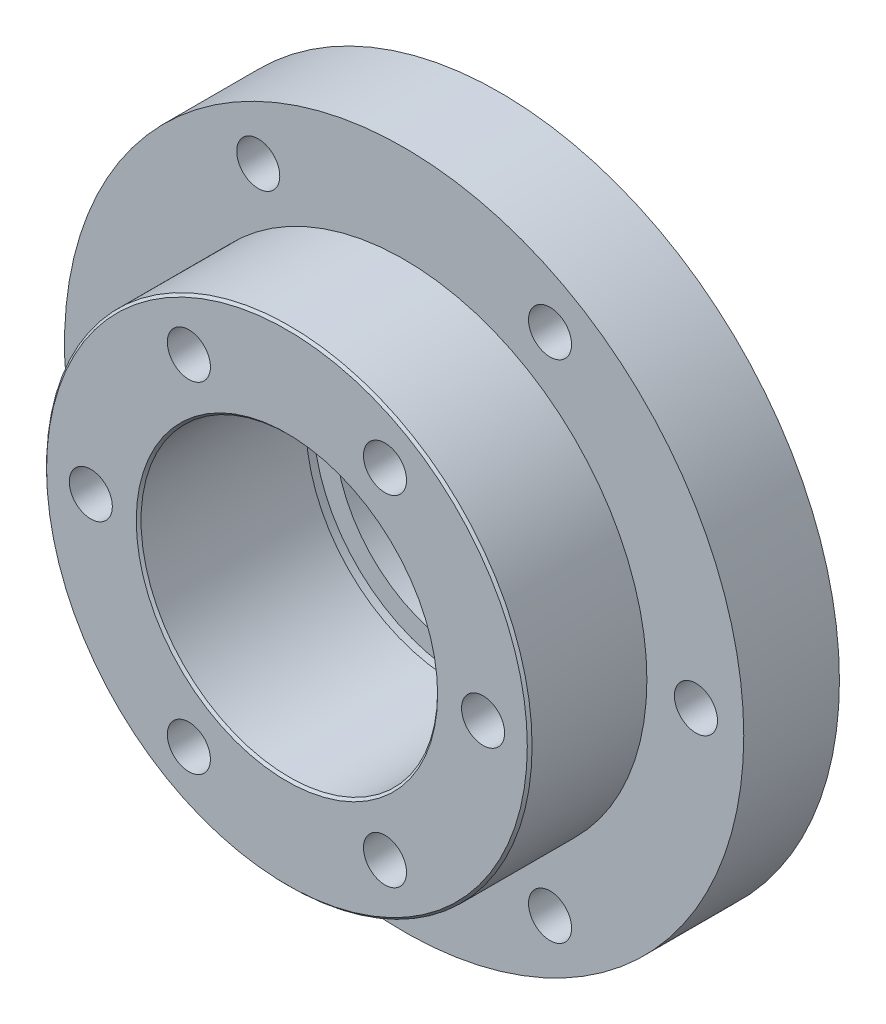
ISO-10303-21;
HEADER;
FILE_DESCRIPTION(('STEP AP214'),'2;1');
FILE_NAME('part.step','',(''),(''),'','','');
FILE_SCHEMA(('AUTOMOTIVE_DESIGN { 1 0 10303 214 1 1 1 1 }'));
ENDSEC;
DATA;
#1=APPLICATION_CONTEXT('core data for automotive mechanical design processes');
#2=APPLICATION_PROTOCOL_DEFINITION('international standard','automotive_design',2000,#1);
#3=PRODUCT_CONTEXT('',#1,'mechanical');
#4=PRODUCT('Part','Part','',(#3));
#5=PRODUCT_RELATED_PRODUCT_CATEGORY('part','',(#4));
#6=PRODUCT_DEFINITION_FORMATION('','',#4);
#7=PRODUCT_DEFINITION_CONTEXT('part definition',#1,'design');
#8=PRODUCT_DEFINITION('design','',#6,#7);
#9=PRODUCT_DEFINITION_SHAPE('','',#8);
#10=(LENGTH_UNIT() NAMED_UNIT(*) SI_UNIT(.MILLI.,.METRE.));
#11=(NAMED_UNIT(*) PLANE_ANGLE_UNIT() SI_UNIT($,.RADIAN.));
#12=(NAMED_UNIT(*) SI_UNIT($,.STERADIAN.) SOLID_ANGLE_UNIT());
#13=UNCERTAINTY_MEASURE_WITH_UNIT(LENGTH_MEASURE(1.E-05),#10,'distance_accuracy_value','');
#14=(GEOMETRIC_REPRESENTATION_CONTEXT(3) GLOBAL_UNCERTAINTY_ASSIGNED_CONTEXT((#13)) GLOBAL_UNIT_ASSIGNED_CONTEXT((#10,
#11,#12)) REPRESENTATION_CONTEXT('',''));
#15=CARTESIAN_POINT('',(0.,0.,0.));
#16=DIRECTION('',(0.,0.,1.));
#17=DIRECTION('',(1.,0.,0.));
#18=AXIS2_PLACEMENT_3D('',#15,#16,#17);
#19=CARTESIAN_POINT('',(0.,0.,8.));
#20=DIRECTION('',(0.,0.,-1.));
#21=DIRECTION('',(-1.,0.,0.));
#22=AXIS2_PLACEMENT_3D('',#19,#20,#21);
#23=CYLINDRICAL_SURFACE('',#22,27.);
#24=CARTESIAN_POINT('',(0.,0.,0.));
#25=DIRECTION('',(0.,0.,-1.));
#26=DIRECTION('',(-1.,0.,0.));
#27=AXIS2_PLACEMENT_3D('',#24,#25,#26);
#28=CIRCLE('',#27,27.);
#29=CARTESIAN_POINT('',(-27.,0.,0.));
#30=VERTEX_POINT('',#29);
#31=EDGE_CURVE('E73',#30,#30,#28,.T.);
#32=ORIENTED_EDGE('',*,*,#31,.T.);
#33=EDGE_LOOP('',(#32));
#34=FACE_BOUND('',#33,.T.);
#35=CARTESIAN_POINT('',(0.,0.,7.49999999999999));
#36=DIRECTION('',(0.,0.,1.));
#37=DIRECTION('',(1.,0.,0.));
#38=AXIS2_PLACEMENT_3D('',#35,#36,#37);
#39=CIRCLE('',#38,27.);
#40=CARTESIAN_POINT('',(27.,0.,7.49999999999999));
#41=VERTEX_POINT('',#40);
#42=EDGE_CURVE('E47',#41,#41,#39,.F.);
#43=ORIENTED_EDGE('',*,*,#42,.F.);
#44=EDGE_LOOP('',(#43));
#45=FACE_BOUND('',#44,.T.);
#46=ADVANCED_FACE('F42',(#34,#45),#23,.F.);
#47=CARTESIAN_POINT('',(0.,0.,20.));
#48=DIRECTION('',(0.,0.,-1.));
#49=DIRECTION('',(-1.,0.,0.));
#50=AXIS2_PLACEMENT_3D('',#47,#48,#49);
#51=CYLINDRICAL_SURFACE('',#50,71.);
#52=CARTESIAN_POINT('',(0.,0.,20.));
#53=DIRECTION('',(0.,0.,1.));
#54=DIRECTION('',(1.,0.,0.));
#55=AXIS2_PLACEMENT_3D('',#52,#53,#54);
#56=CIRCLE('',#55,71.);
#57=CARTESIAN_POINT('',(71.,0.,20.));
#58=VERTEX_POINT('',#57);
#59=EDGE_CURVE('E72',#58,#58,#56,.T.);
#60=ORIENTED_EDGE('',*,*,#59,.F.);
#61=EDGE_LOOP('',(#60));
#62=FACE_BOUND('',#61,.T.);
#63=CARTESIAN_POINT('',(0.,0.,0.));
#64=DIRECTION('',(0.,0.,1.));
#65=DIRECTION('',(1.,0.,0.));
#66=AXIS2_PLACEMENT_3D('',#63,#64,#65);
#67=CIRCLE('',#66,71.);
#68=CARTESIAN_POINT('',(71.,0.,0.));
#69=VERTEX_POINT('',#68);
#70=EDGE_CURVE('E68',#69,#69,#67,.T.);
#71=ORIENTED_EDGE('',*,*,#70,.T.);
#72=EDGE_LOOP('',(#71));
#73=FACE_BOUND('',#72,.T.);
#74=ADVANCED_FACE('F242',(#62,#73),#51,.T.);
#75=CARTESIAN_POINT('',(0.,0.,20.));
#76=DIRECTION('',(0.,0.,1.));
#77=DIRECTION('',(1.,0.,0.));
#78=AXIS2_PLACEMENT_3D('',#75,#76,#77);
#79=PLANE('',#78);
#80=CARTESIAN_POINT('',(-61.,0.,20.));
#81=DIRECTION('',(0.,0.,1.));
#82=DIRECTION('',(1.,0.,0.));
#83=AXIS2_PLACEMENT_3D('',#80,#81,#82);
#84=CIRCLE('',#83,4.5);
#85=CARTESIAN_POINT('',(-56.5,0.,20.));
#86=VERTEX_POINT('',#85);
#87=EDGE_CURVE('E126',#86,#86,#84,.T.);
#88=ORIENTED_EDGE('',*,*,#87,.F.);
#89=EDGE_LOOP('',(#88));
#90=FACE_BOUND('',#89,.T.);
#91=CARTESIAN_POINT('',(-30.5000000000006,-52.8275496308504,20.));
#92=DIRECTION('',(0.,0.,1.));
#93=DIRECTION('',(1.,0.,0.));
#94=AXIS2_PLACEMENT_3D('',#91,#92,#93);
#95=CIRCLE('',#94,4.5);
#96=CARTESIAN_POINT('',(-26.0000000000006,-52.8275496308504,20.));
#97=VERTEX_POINT('',#96);
#98=EDGE_CURVE('E105',#97,#97,#95,.T.);
#99=ORIENTED_EDGE('',*,*,#98,.F.);
#100=EDGE_LOOP('',(#99));
#101=FACE_BOUND('',#100,.T.);
#102=CARTESIAN_POINT('',(30.4999999999995,-52.827549630851,20.));
#103=DIRECTION('',(0.,0.,1.));
#104=DIRECTION('',(1.,0.,0.));
#105=AXIS2_PLACEMENT_3D('',#102,#103,#104);
#106=CIRCLE('',#105,4.5);
#107=CARTESIAN_POINT('',(34.9999999999995,-52.827549630851,20.));
#108=VERTEX_POINT('',#107);
#109=EDGE_CURVE('E96',#108,#108,#106,.T.);
#110=ORIENTED_EDGE('',*,*,#109,.F.);
#111=EDGE_LOOP('',(#110));
#112=FACE_BOUND('',#111,.T.);
#113=CARTESIAN_POINT('',(61.,-4.25960723338862E-13,20.));
#114=DIRECTION('',(0.,0.,1.));
#115=DIRECTION('',(1.,0.,0.));
#116=AXIS2_PLACEMENT_3D('',#113,#114,#115);
#117=CIRCLE('',#116,4.5);
#118=CARTESIAN_POINT('',(65.5,-4.25960723338862E-13,20.));
#119=VERTEX_POINT('',#118);
#120=EDGE_CURVE('E106',#119,#119,#117,.T.);
#121=ORIENTED_EDGE('',*,*,#120,.F.);
#122=EDGE_LOOP('',(#121));
#123=FACE_BOUND('',#122,.T.);
#124=CARTESIAN_POINT('',(30.5000000000002,52.8275496308506,20.));
#125=DIRECTION('',(0.,0.,1.));
#126=DIRECTION('',(1.,0.,0.));
#127=AXIS2_PLACEMENT_3D('',#124,#125,#126);
#128=CIRCLE('',#127,4.5);
#129=CARTESIAN_POINT('',(35.0000000000002,52.8275496308506,20.));
#130=VERTEX_POINT('',#129);
#131=EDGE_CURVE('E114',#130,#130,#128,.T.);
#132=ORIENTED_EDGE('',*,*,#131,.F.);
#133=EDGE_LOOP('',(#132));
#134=FACE_BOUND('',#133,.T.);
#135=CARTESIAN_POINT('',(-30.4999999999999,52.8275496308508,20.));
#136=DIRECTION('',(0.,0.,1.));
#137=DIRECTION('',(1.,0.,0.));
#138=AXIS2_PLACEMENT_3D('',#135,#136,#137);
#139=CIRCLE('',#138,4.5);
#140=CARTESIAN_POINT('',(-25.9999999999999,52.8275496308508,20.));
#141=VERTEX_POINT('',#140);
#142=EDGE_CURVE('E122',#141,#141,#139,.T.);
#143=ORIENTED_EDGE('',*,*,#142,.F.);
#144=EDGE_LOOP('',(#143));
#145=FACE_BOUND('',#144,.T.);
#146=CARTESIAN_POINT('',(0.,0.,20.));
#147=DIRECTION('',(0.,0.,1.));
#148=DIRECTION('',(1.,0.,0.));
#149=AXIS2_PLACEMENT_3D('',#146,#147,#148);
#150=CIRCLE('',#149,50.75);
#151=CARTESIAN_POINT('',(50.75,0.,20.));
#152=VERTEX_POINT('',#151);
#153=EDGE_CURVE('E67',#152,#152,#150,.T.);
#154=ORIENTED_EDGE('',*,*,#153,.F.);
#155=EDGE_LOOP('',(#154));
#156=FACE_BOUND('',#155,.T.);
#157=ORIENTED_EDGE('',*,*,#59,.T.);
#158=EDGE_LOOP('',(#157));
#159=FACE_BOUND('',#158,.T.);
#160=ADVANCED_FACE('F248',(#90,#101,#112,#123,#134,#145,#156,#159),#79,.T.);
#161=CARTESIAN_POINT('',(0.,0.,0.));
#162=DIRECTION('',(0.,0.,1.));
#163=DIRECTION('',(1.,0.,0.));
#164=AXIS2_PLACEMENT_3D('',#161,#162,#163);
#165=PLANE('',#164);
#166=CARTESIAN_POINT('',(41.,0.,0.));
#167=DIRECTION('',(0.,0.,-1.));
#168=DIRECTION('',(-1.,0.,0.));
#169=AXIS2_PLACEMENT_3D('',#166,#167,#168);
#170=CIRCLE('',#169,4.);
#171=CARTESIAN_POINT('',(37.,0.,0.));
#172=VERTEX_POINT('',#171);
#173=EDGE_CURVE('E144',#172,#172,#170,.T.);
#174=ORIENTED_EDGE('',*,*,#173,.F.);
#175=EDGE_LOOP('',(#174));
#176=FACE_BOUND('',#175,.T.);
#177=CARTESIAN_POINT('',(-61.,0.,0.));
#178=DIRECTION('',(0.,0.,1.));
#179=DIRECTION('',(1.,0.,0.));
#180=AXIS2_PLACEMENT_3D('',#177,#178,#179);
#181=CIRCLE('',#180,4.5);
#182=CARTESIAN_POINT('',(-56.5,0.,0.));
#183=VERTEX_POINT('',#182);
#184=EDGE_CURVE('E92',#183,#183,#181,.F.);
#185=ORIENTED_EDGE('',*,*,#184,.F.);
#186=EDGE_LOOP('',(#185));
#187=FACE_BOUND('',#186,.T.);
#188=CARTESIAN_POINT('',(-30.5000000000006,-52.8275496308504,0.));
#189=DIRECTION('',(0.,0.,1.));
#190=DIRECTION('',(1.,0.,0.));
#191=AXIS2_PLACEMENT_3D('',#188,#189,#190);
#192=CIRCLE('',#191,4.5);
#193=CARTESIAN_POINT('',(-26.0000000000006,-52.8275496308504,0.));
#194=VERTEX_POINT('',#193);
#195=EDGE_CURVE('E133',#194,#194,#192,.F.);
#196=ORIENTED_EDGE('',*,*,#195,.F.);
#197=EDGE_LOOP('',(#196));
#198=FACE_BOUND('',#197,.T.);
#199=CARTESIAN_POINT('',(30.4999999999995,-52.827549630851,0.));
#200=DIRECTION('',(0.,0.,1.));
#201=DIRECTION('',(1.,0.,0.));
#202=AXIS2_PLACEMENT_3D('',#199,#200,#201);
#203=CIRCLE('',#202,4.5);
#204=CARTESIAN_POINT('',(34.9999999999995,-52.827549630851,0.));
#205=VERTEX_POINT('',#204);
#206=EDGE_CURVE('E101',#205,#205,#203,.F.);
#207=ORIENTED_EDGE('',*,*,#206,.F.);
#208=EDGE_LOOP('',(#207));
#209=FACE_BOUND('',#208,.T.);
#210=CARTESIAN_POINT('',(61.,-4.25960723338862E-13,0.));
#211=DIRECTION('',(0.,0.,1.));
#212=DIRECTION('',(1.,0.,0.));
#213=AXIS2_PLACEMENT_3D('',#210,#211,#212);
#214=CIRCLE('',#213,4.5);
#215=CARTESIAN_POINT('',(65.5,-4.25960723338862E-13,0.));
#216=VERTEX_POINT('',#215);
#217=EDGE_CURVE('E100',#216,#216,#214,.F.);
#218=ORIENTED_EDGE('',*,*,#217,.F.);
#219=EDGE_LOOP('',(#218));
#220=FACE_BOUND('',#219,.T.);
#221=CARTESIAN_POINT('',(30.5000000000002,52.8275496308506,0.));
#222=DIRECTION('',(0.,0.,1.));
#223=DIRECTION('',(1.,0.,0.));
#224=AXIS2_PLACEMENT_3D('',#221,#222,#223);
#225=CIRCLE('',#224,4.5);
#226=CARTESIAN_POINT('',(35.0000000000002,52.8275496308506,0.));
#227=VERTEX_POINT('',#226);
#228=EDGE_CURVE('E110',#227,#227,#225,.F.);
#229=ORIENTED_EDGE('',*,*,#228,.F.);
#230=EDGE_LOOP('',(#229));
#231=FACE_BOUND('',#230,.T.);
#232=CARTESIAN_POINT('',(-30.4999999999999,52.8275496308508,0.));
#233=DIRECTION('',(0.,0.,1.));
#234=DIRECTION('',(1.,0.,0.));
#235=AXIS2_PLACEMENT_3D('',#232,#233,#234);
#236=CIRCLE('',#235,4.5);
#237=CARTESIAN_POINT('',(-25.9999999999999,52.8275496308508,0.));
#238=VERTEX_POINT('',#237);
#239=EDGE_CURVE('E118',#238,#238,#236,.F.);
#240=ORIENTED_EDGE('',*,*,#239,.F.);
#241=EDGE_LOOP('',(#240));
#242=FACE_BOUND('',#241,.T.);
#243=ORIENTED_EDGE('',*,*,#31,.F.);
#244=EDGE_LOOP('',(#243));
#245=FACE_BOUND('',#244,.T.);
#246=ORIENTED_EDGE('',*,*,#70,.F.);
#247=EDGE_LOOP('',(#246));
#248=FACE_BOUND('',#247,.T.);
#249=ADVANCED_FACE('F259',(#176,#187,#198,#209,#220,#231,#242,#245,#248),#165,.F.);
#250=CARTESIAN_POINT('',(0.,0.,44.5));
#251=DIRECTION('',(0.,0.,-1.));
#252=DIRECTION('',(-1.,0.,0.));
#253=AXIS2_PLACEMENT_3D('',#250,#251,#252);
#254=CYLINDRICAL_SURFACE('',#253,50.75);
#255=CARTESIAN_POINT('',(0.,0.,43.9999999999999));
#256=DIRECTION('',(0.,0.,1.));
#257=DIRECTION('',(1.,0.,0.));
#258=AXIS2_PLACEMENT_3D('',#255,#256,#257);
#259=CIRCLE('',#258,50.75);
#260=CARTESIAN_POINT('',(50.75,0.,43.9999999999999));
#261=VERTEX_POINT('',#260);
#262=EDGE_CURVE('E52',#261,#261,#259,.F.);
#263=ORIENTED_EDGE('',*,*,#262,.T.);
#264=EDGE_LOOP('',(#263));
#265=FACE_BOUND('',#264,.T.);
#266=ORIENTED_EDGE('',*,*,#153,.T.);
#267=EDGE_LOOP('',(#266));
#268=FACE_BOUND('',#267,.T.);
#269=ADVANCED_FACE('F213',(#265,#268),#254,.T.);
#270=CARTESIAN_POINT('',(0.,0.,44.5));
#271=DIRECTION('',(0.,0.,1.));
#272=DIRECTION('',(1.,0.,0.));
#273=AXIS2_PLACEMENT_3D('',#270,#271,#272);
#274=PLANE('',#273);
#275=CARTESIAN_POINT('',(41.,0.,44.5));
#276=DIRECTION('',(0.,0.,1.));
#277=DIRECTION('',(1.,0.,0.));
#278=AXIS2_PLACEMENT_3D('',#275,#276,#277);
#279=CIRCLE('',#278,4.5);
#280=CARTESIAN_POINT('',(45.5,0.,44.5));
#281=VERTEX_POINT('',#280);
#282=EDGE_CURVE('E185',#281,#281,#279,.T.);
#283=ORIENTED_EDGE('',*,*,#282,.F.);
#284=EDGE_LOOP('',(#283));
#285=FACE_BOUND('',#284,.T.);
#286=CARTESIAN_POINT('',(20.5000000000004,35.5070415551617,44.5));
#287=DIRECTION('',(0.,0.,1.));
#288=DIRECTION('',(1.,0.,0.));
#289=AXIS2_PLACEMENT_3D('',#286,#287,#288);
#290=CIRCLE('',#289,4.5);
#291=CARTESIAN_POINT('',(25.0000000000004,35.5070415551617,44.5));
#292=VERTEX_POINT('',#291);
#293=EDGE_CURVE('E157',#292,#292,#290,.T.);
#294=ORIENTED_EDGE('',*,*,#293,.F.);
#295=EDGE_LOOP('',(#294));
#296=FACE_BOUND('',#295,.T.);
#297=CARTESIAN_POINT('',(-20.4999999999997,35.5070415551622,44.5));
#298=DIRECTION('',(0.,0.,1.));
#299=DIRECTION('',(1.,0.,0.));
#300=AXIS2_PLACEMENT_3D('',#297,#298,#299);
#301=CIRCLE('',#300,4.5);
#302=CARTESIAN_POINT('',(-15.9999999999997,35.5070415551622,44.5));
#303=VERTEX_POINT('',#302);
#304=EDGE_CURVE('E156',#303,#303,#301,.T.);
#305=ORIENTED_EDGE('',*,*,#304,.F.);
#306=EDGE_LOOP('',(#305));
#307=FACE_BOUND('',#306,.T.);
#308=CARTESIAN_POINT('',(-41.,2.86301469785137E-13,44.5));
#309=DIRECTION('',(0.,0.,1.));
#310=DIRECTION('',(1.,0.,0.));
#311=AXIS2_PLACEMENT_3D('',#308,#309,#310);
#312=CIRCLE('',#311,4.5);
#313=CARTESIAN_POINT('',(-36.5,2.86301469785137E-13,44.5));
#314=VERTEX_POINT('',#313);
#315=EDGE_CURVE('E165',#314,#314,#312,.T.);
#316=ORIENTED_EDGE('',*,*,#315,.F.);
#317=EDGE_LOOP('',(#316));
#318=FACE_BOUND('',#317,.T.);
#319=CARTESIAN_POINT('',(-20.5000000000002,-35.5070415551619,44.5));
#320=DIRECTION('',(0.,0.,1.));
#321=DIRECTION('',(1.,0.,0.));
#322=AXIS2_PLACEMENT_3D('',#319,#320,#321);
#323=CIRCLE('',#322,4.5);
#324=CARTESIAN_POINT('',(-16.0000000000002,-35.5070415551619,44.5));
#325=VERTEX_POINT('',#324);
#326=EDGE_CURVE('E173',#325,#325,#323,.T.);
#327=ORIENTED_EDGE('',*,*,#326,.F.);
#328=EDGE_LOOP('',(#327));
#329=FACE_BOUND('',#328,.T.);
#330=CARTESIAN_POINT('',(20.4999999999999,-35.507041555162,44.5));
#331=DIRECTION('',(0.,0.,1.));
#332=DIRECTION('',(1.,0.,0.));
#333=AXIS2_PLACEMENT_3D('',#330,#331,#332);
#334=CIRCLE('',#333,4.5);
#335=CARTESIAN_POINT('',(24.9999999999999,-35.507041555162,44.5));
#336=VERTEX_POINT('',#335);
#337=EDGE_CURVE('E181',#336,#336,#334,.T.);
#338=ORIENTED_EDGE('',*,*,#337,.F.);
#339=EDGE_LOOP('',(#338));
#340=FACE_BOUND('',#339,.T.);
#341=CARTESIAN_POINT('',(0.,0.,44.5));
#342=DIRECTION('',(0.,0.,1.));
#343=DIRECTION('',(1.,0.,0.));
#344=AXIS2_PLACEMENT_3D('',#341,#342,#343);
#345=CIRCLE('',#344,50.25);
#346=CARTESIAN_POINT('',(50.25,0.,44.5));
#347=VERTEX_POINT('',#346);
#348=EDGE_CURVE('E57',#347,#347,#345,.T.);
#349=ORIENTED_EDGE('',*,*,#348,.T.);
#350=EDGE_LOOP('',(#349));
#351=FACE_BOUND('',#350,.T.);
#352=CARTESIAN_POINT('',(0.,0.,44.5));
#353=DIRECTION('',(0.,0.,1.));
#354=DIRECTION('',(1.,0.,0.));
#355=AXIS2_PLACEMENT_3D('',#352,#353,#354);
#356=CIRCLE('',#355,31.4999999999999);
#357=CARTESIAN_POINT('',(31.4999999999999,0.,44.5));
#358=VERTEX_POINT('',#357);
#359=EDGE_CURVE('E63',#358,#358,#356,.F.);
#360=ORIENTED_EDGE('',*,*,#359,.T.);
#361=EDGE_LOOP('',(#360));
#362=FACE_BOUND('',#361,.T.);
#363=ADVANCED_FACE('F209',(#285,#296,#307,#318,#329,#340,#351,#362),#274,.T.);
#364=CARTESIAN_POINT('',(0.,0.,9.49999999999999));
#365=DIRECTION('',(0.,0.,1.));
#366=DIRECTION('',(1.,0.,0.));
#367=AXIS2_PLACEMENT_3D('',#364,#365,#366);
#368=CYLINDRICAL_SURFACE('',#367,31.);
#369=CARTESIAN_POINT('',(0.,0.,44.));
#370=DIRECTION('',(0.,0.,1.));
#371=DIRECTION('',(1.,0.,0.));
#372=AXIS2_PLACEMENT_3D('',#369,#370,#371);
#373=CIRCLE('',#372,31.);
#374=CARTESIAN_POINT('',(31.,0.,44.));
#375=VERTEX_POINT('',#374);
#376=EDGE_CURVE('E10',#375,#375,#373,.T.);
#377=ORIENTED_EDGE('',*,*,#376,.T.);
#378=EDGE_LOOP('',(#377));
#379=FACE_BOUND('',#378,.T.);
#380=CARTESIAN_POINT('',(0.,0.,9.49999999999999));
#381=DIRECTION('',(0.,0.,1.));
#382=DIRECTION('',(1.,0.,0.));
#383=AXIS2_PLACEMENT_3D('',#380,#381,#382);
#384=CIRCLE('',#383,31.);
#385=CARTESIAN_POINT('',(31.,0.,9.49999999999999));
#386=VERTEX_POINT('',#385);
#387=EDGE_CURVE('E80',#386,#386,#384,.T.);
#388=ORIENTED_EDGE('',*,*,#387,.F.);
#389=EDGE_LOOP('',(#388));
#390=FACE_BOUND('',#389,.T.);
#391=ADVANCED_FACE('F212',(#379,#390),#368,.F.);
#392=CARTESIAN_POINT('',(0.,0.,44.5));
#393=DIRECTION('',(0.,0.,-1.));
#394=DIRECTION('',(-1.,0.,0.));
#395=AXIS2_PLACEMENT_3D('',#392,#393,#394);
#396=CONICAL_SURFACE('',#395,50.25,0.785398163397421);
#397=ORIENTED_EDGE('',*,*,#262,.F.);
#398=EDGE_LOOP('',(#397));
#399=FACE_BOUND('',#398,.T.);
#400=ORIENTED_EDGE('',*,*,#348,.F.);
#401=EDGE_LOOP('',(#400));
#402=FACE_BOUND('',#401,.T.);
#403=ADVANCED_FACE('F232',(#399,#402),#396,.T.);
#404=CARTESIAN_POINT('',(0.,0.,44.));
#405=DIRECTION('',(0.,0.,1.));
#406=DIRECTION('',(1.,0.,0.));
#407=AXIS2_PLACEMENT_3D('',#404,#405,#406);
#408=CONICAL_SURFACE('',#407,31.,0.785398163397448);
#409=ORIENTED_EDGE('',*,*,#359,.F.);
#410=EDGE_LOOP('',(#409));
#411=FACE_BOUND('',#410,.T.);
#412=ORIENTED_EDGE('',*,*,#376,.F.);
#413=EDGE_LOOP('',(#412));
#414=FACE_BOUND('',#413,.T.);
#415=ADVANCED_FACE('F45',(#411,#414),#408,.F.);
#416=CARTESIAN_POINT('',(0.,0.,7.49999999999999));
#417=DIRECTION('',(0.,0.,1.));
#418=DIRECTION('',(1.,0.,0.));
#419=AXIS2_PLACEMENT_3D('',#416,#417,#418);
#420=PLANE('',#419);
#421=CARTESIAN_POINT('',(0.,0.,7.49999999999999));
#422=DIRECTION('',(0.,0.,1.));
#423=DIRECTION('',(1.,0.,0.));
#424=AXIS2_PLACEMENT_3D('',#421,#422,#423);
#425=CIRCLE('',#424,31.5);
#426=CARTESIAN_POINT('',(31.5,0.,7.49999999999999));
#427=VERTEX_POINT('',#426);
#428=EDGE_CURVE('E91',#427,#427,#425,.T.);
#429=ORIENTED_EDGE('',*,*,#428,.T.);
#430=EDGE_LOOP('',(#429));
#431=FACE_BOUND('',#430,.T.);
#432=ORIENTED_EDGE('',*,*,#42,.T.);
#433=EDGE_LOOP('',(#432));
#434=FACE_BOUND('',#433,.T.);
#435=ADVANCED_FACE('F231',(#431,#434),#420,.T.);
#436=CARTESIAN_POINT('',(0.,0.,7.49999999999999));
#437=DIRECTION('',(0.,0.,1.));
#438=DIRECTION('',(1.,0.,0.));
#439=AXIS2_PLACEMENT_3D('',#436,#437,#438);
#440=CYLINDRICAL_SURFACE('',#439,31.5);
#441=ORIENTED_EDGE('',*,*,#428,.F.);
#442=EDGE_LOOP('',(#441));
#443=FACE_BOUND('',#442,.T.);
#444=CARTESIAN_POINT('',(0.,0.,9.49999999999999));
#445=DIRECTION('',(0.,0.,1.));
#446=DIRECTION('',(1.,0.,0.));
#447=AXIS2_PLACEMENT_3D('',#444,#445,#446);
#448=CIRCLE('',#447,31.5);
#449=CARTESIAN_POINT('',(31.5,0.,9.49999999999999));
#450=VERTEX_POINT('',#449);
#451=EDGE_CURVE('E87',#450,#450,#448,.T.);
#452=ORIENTED_EDGE('',*,*,#451,.T.);
#453=EDGE_LOOP('',(#452));
#454=FACE_BOUND('',#453,.T.);
#455=ADVANCED_FACE('F237',(#443,#454),#440,.F.);
#456=CARTESIAN_POINT('',(0.,0.,9.49999999999999));
#457=DIRECTION('',(0.,0.,1.));
#458=DIRECTION('',(1.,0.,0.));
#459=AXIS2_PLACEMENT_3D('',#456,#457,#458);
#460=PLANE('',#459);
#461=ORIENTED_EDGE('',*,*,#387,.T.);
#462=EDGE_LOOP('',(#461));
#463=FACE_BOUND('',#462,.T.);
#464=ORIENTED_EDGE('',*,*,#451,.F.);
#465=EDGE_LOOP('',(#464));
#466=FACE_BOUND('',#465,.T.);
#467=ADVANCED_FACE('F297',(#463,#466),#460,.F.);
#468=CARTESIAN_POINT('',(-30.4999999999999,52.8275496308508,-0.001000000000001));
#469=DIRECTION('',(0.,0.,1.));
#470=DIRECTION('',(1.,0.,0.));
#471=AXIS2_PLACEMENT_3D('',#468,#469,#470);
#472=CYLINDRICAL_SURFACE('',#471,4.5);
#473=ORIENTED_EDGE('',*,*,#142,.T.);
#474=EDGE_LOOP('',(#473));
#475=FACE_BOUND('',#474,.T.);
#476=ORIENTED_EDGE('',*,*,#239,.T.);
#477=EDGE_LOOP('',(#476));
#478=FACE_BOUND('',#477,.T.);
#479=ADVANCED_FACE('F294',(#475,#478),#472,.F.);
#480=CARTESIAN_POINT('',(30.5000000000002,52.8275496308506,-0.001000000000001));
#481=DIRECTION('',(0.,0.,1.));
#482=DIRECTION('',(1.,0.,0.));
#483=AXIS2_PLACEMENT_3D('',#480,#481,#482);
#484=CYLINDRICAL_SURFACE('',#483,4.5);
#485=ORIENTED_EDGE('',*,*,#131,.T.);
#486=EDGE_LOOP('',(#485));
#487=FACE_BOUND('',#486,.T.);
#488=ORIENTED_EDGE('',*,*,#228,.T.);
#489=EDGE_LOOP('',(#488));
#490=FACE_BOUND('',#489,.T.);
#491=ADVANCED_FACE('F296',(#487,#490),#484,.F.);
#492=CARTESIAN_POINT('',(61.,-4.25960723338862E-13,-0.001000000000001));
#493=DIRECTION('',(0.,0.,1.));
#494=DIRECTION('',(1.,0.,0.));
#495=AXIS2_PLACEMENT_3D('',#492,#493,#494);
#496=CYLINDRICAL_SURFACE('',#495,4.5);
#497=ORIENTED_EDGE('',*,*,#120,.T.);
#498=EDGE_LOOP('',(#497));
#499=FACE_BOUND('',#498,.T.);
#500=ORIENTED_EDGE('',*,*,#217,.T.);
#501=EDGE_LOOP('',(#500));
#502=FACE_BOUND('',#501,.T.);
#503=ADVANCED_FACE('F304',(#499,#502),#496,.F.);
#504=CARTESIAN_POINT('',(30.4999999999995,-52.827549630851,-0.001000000000001));
#505=DIRECTION('',(0.,0.,1.));
#506=DIRECTION('',(1.,0.,0.));
#507=AXIS2_PLACEMENT_3D('',#504,#505,#506);
#508=CYLINDRICAL_SURFACE('',#507,4.5);
#509=ORIENTED_EDGE('',*,*,#109,.T.);
#510=EDGE_LOOP('',(#509));
#511=FACE_BOUND('',#510,.T.);
#512=ORIENTED_EDGE('',*,*,#206,.T.);
#513=EDGE_LOOP('',(#512));
#514=FACE_BOUND('',#513,.T.);
#515=ADVANCED_FACE('F314',(#511,#514),#508,.F.);
#516=CARTESIAN_POINT('',(-30.5000000000006,-52.8275496308504,-0.001000000000001));
#517=DIRECTION('',(0.,0.,1.));
#518=DIRECTION('',(1.,0.,0.));
#519=AXIS2_PLACEMENT_3D('',#516,#517,#518);
#520=CYLINDRICAL_SURFACE('',#519,4.5);
#521=ORIENTED_EDGE('',*,*,#98,.T.);
#522=EDGE_LOOP('',(#521));
#523=FACE_BOUND('',#522,.T.);
#524=ORIENTED_EDGE('',*,*,#195,.T.);
#525=EDGE_LOOP('',(#524));
#526=FACE_BOUND('',#525,.T.);
#527=ADVANCED_FACE('F309',(#523,#526),#520,.F.);
#528=CARTESIAN_POINT('',(-61.,0.,-0.001000000000001));
#529=DIRECTION('',(0.,0.,1.));
#530=DIRECTION('',(1.,0.,0.));
#531=AXIS2_PLACEMENT_3D('',#528,#529,#530);
#532=CYLINDRICAL_SURFACE('',#531,4.5);
#533=ORIENTED_EDGE('',*,*,#87,.T.);
#534=EDGE_LOOP('',(#533));
#535=FACE_BOUND('',#534,.T.);
#536=ORIENTED_EDGE('',*,*,#184,.T.);
#537=EDGE_LOOP('',(#536));
#538=FACE_BOUND('',#537,.T.);
#539=ADVANCED_FACE('F321',(#535,#538),#532,.F.);
#540=CARTESIAN_POINT('',(41.,0.,10.));
#541=DIRECTION('',(0.,0.,-1.));
#542=DIRECTION('',(-1.,0.,0.));
#543=AXIS2_PLACEMENT_3D('',#540,#541,#542);
#544=CYLINDRICAL_SURFACE('',#543,4.);
#545=CARTESIAN_POINT('',(41.,0.,10.));
#546=DIRECTION('',(0.,0.,-1.));
#547=DIRECTION('',(-1.,0.,0.));
#548=AXIS2_PLACEMENT_3D('',#545,#546,#547);
#549=CIRCLE('',#548,4.);
#550=CARTESIAN_POINT('',(37.,0.,10.));
#551=VERTEX_POINT('',#550);
#552=EDGE_CURVE('E137',#551,#551,#549,.T.);
#553=ORIENTED_EDGE('',*,*,#552,.F.);
#554=EDGE_LOOP('',(#553));
#555=FACE_BOUND('',#554,.T.);
#556=ORIENTED_EDGE('',*,*,#173,.T.);
#557=EDGE_LOOP('',(#556));
#558=FACE_BOUND('',#557,.T.);
#559=ADVANCED_FACE('F342',(#555,#558),#544,.F.);
#560=CARTESIAN_POINT('',(41.,0.,10.));
#561=DIRECTION('',(0.,0.,-1.));
#562=DIRECTION('',(-1.,0.,0.));
#563=AXIS2_PLACEMENT_3D('',#560,#561,#562);
#564=PLANE('',#563);
#565=ORIENTED_EDGE('',*,*,#552,.T.);
#566=EDGE_LOOP('',(#565));
#567=FACE_BOUND('',#566,.T.);
#568=ADVANCED_FACE('F349',(#567),#564,.T.);
#569=CARTESIAN_POINT('',(20.4999999999999,-35.507041555162,32.5));
#570=DIRECTION('',(0.,0.,1.));
#571=DIRECTION('',(1.,0.,0.));
#572=AXIS2_PLACEMENT_3D('',#569,#570,#571);
#573=CYLINDRICAL_SURFACE('',#572,4.5);
#574=CARTESIAN_POINT('',(20.4999999999999,-35.507041555162,32.5));
#575=DIRECTION('',(0.,0.,1.));
#576=DIRECTION('',(1.,0.,0.));
#577=AXIS2_PLACEMENT_3D('',#574,#575,#576);
#578=CIRCLE('',#577,4.5);
#579=CARTESIAN_POINT('',(24.9999999999999,-35.507041555162,32.5));
#580=VERTEX_POINT('',#579);
#581=EDGE_CURVE('E177',#580,#580,#578,.T.);
#582=ORIENTED_EDGE('',*,*,#581,.F.);
#583=EDGE_LOOP('',(#582));
#584=FACE_BOUND('',#583,.T.);
#585=ORIENTED_EDGE('',*,*,#337,.T.);
#586=EDGE_LOOP('',(#585));
#587=FACE_BOUND('',#586,.T.);
#588=ADVANCED_FACE('F356',(#584,#587),#573,.F.);
#589=CARTESIAN_POINT('',(20.4999999999999,-35.507041555162,32.5));
#590=DIRECTION('',(0.,0.,1.));
#591=DIRECTION('',(1.,0.,0.));
#592=AXIS2_PLACEMENT_3D('',#589,#590,#591);
#593=PLANE('',#592);
#594=ORIENTED_EDGE('',*,*,#581,.T.);
#595=EDGE_LOOP('',(#594));
#596=FACE_BOUND('',#595,.T.);
#597=ADVANCED_FACE('F382',(#596),#593,.T.);
#598=CARTESIAN_POINT('',(-20.5000000000002,-35.5070415551619,32.5));
#599=DIRECTION('',(0.,0.,1.));
#600=DIRECTION('',(1.,0.,0.));
#601=AXIS2_PLACEMENT_3D('',#598,#599,#600);
#602=CYLINDRICAL_SURFACE('',#601,4.5);
#603=CARTESIAN_POINT('',(-20.5000000000002,-35.5070415551619,32.5));
#604=DIRECTION('',(0.,0.,1.));
#605=DIRECTION('',(1.,0.,0.));
#606=AXIS2_PLACEMENT_3D('',#603,#604,#605);
#607=CIRCLE('',#606,4.5);
#608=CARTESIAN_POINT('',(-16.0000000000002,-35.5070415551619,32.5));
#609=VERTEX_POINT('',#608);
#610=EDGE_CURVE('E169',#609,#609,#607,.T.);
#611=ORIENTED_EDGE('',*,*,#610,.F.);
#612=EDGE_LOOP('',(#611));
#613=FACE_BOUND('',#612,.T.);
#614=ORIENTED_EDGE('',*,*,#326,.T.);
#615=EDGE_LOOP('',(#614));
#616=FACE_BOUND('',#615,.T.);
#617=ADVANCED_FACE('F378',(#613,#616),#602,.F.);
#618=CARTESIAN_POINT('',(-20.5000000000002,-35.5070415551619,32.5));
#619=DIRECTION('',(0.,0.,1.));
#620=DIRECTION('',(1.,0.,0.));
#621=AXIS2_PLACEMENT_3D('',#618,#619,#620);
#622=PLANE('',#621);
#623=ORIENTED_EDGE('',*,*,#610,.T.);
#624=EDGE_LOOP('',(#623));
#625=FACE_BOUND('',#624,.T.);
#626=ADVANCED_FACE('F374',(#625),#622,.T.);
#627=CARTESIAN_POINT('',(-41.,2.86301469785137E-13,32.5));
#628=DIRECTION('',(0.,0.,1.));
#629=DIRECTION('',(1.,0.,0.));
#630=AXIS2_PLACEMENT_3D('',#627,#628,#629);
#631=CYLINDRICAL_SURFACE('',#630,4.5);
#632=CARTESIAN_POINT('',(-41.,2.86301469785137E-13,32.5));
#633=DIRECTION('',(0.,0.,1.));
#634=DIRECTION('',(1.,0.,0.));
#635=AXIS2_PLACEMENT_3D('',#632,#633,#634);
#636=CIRCLE('',#635,4.5);
#637=CARTESIAN_POINT('',(-36.5,2.86301469785137E-13,32.5));
#638=VERTEX_POINT('',#637);
#639=EDGE_CURVE('E161',#638,#638,#636,.T.);
#640=ORIENTED_EDGE('',*,*,#639,.F.);
#641=EDGE_LOOP('',(#640));
#642=FACE_BOUND('',#641,.T.);
#643=ORIENTED_EDGE('',*,*,#315,.T.);
#644=EDGE_LOOP('',(#643));
#645=FACE_BOUND('',#644,.T.);
#646=ADVANCED_FACE('F370',(#642,#645),#631,.F.);
#647=CARTESIAN_POINT('',(-41.,2.86301469785137E-13,32.5));
#648=DIRECTION('',(0.,0.,1.));
#649=DIRECTION('',(1.,0.,0.));
#650=AXIS2_PLACEMENT_3D('',#647,#648,#649);
#651=PLANE('',#650);
#652=ORIENTED_EDGE('',*,*,#639,.T.);
#653=EDGE_LOOP('',(#652));
#654=FACE_BOUND('',#653,.T.);
#655=ADVANCED_FACE('F366',(#654),#651,.T.);
#656=CARTESIAN_POINT('',(-20.4999999999997,35.5070415551622,32.5));
#657=DIRECTION('',(0.,0.,1.));
#658=DIRECTION('',(1.,0.,0.));
#659=AXIS2_PLACEMENT_3D('',#656,#657,#658);
#660=CYLINDRICAL_SURFACE('',#659,4.5);
#661=CARTESIAN_POINT('',(-20.4999999999997,35.5070415551622,32.5));
#662=DIRECTION('',(0.,0.,1.));
#663=DIRECTION('',(1.,0.,0.));
#664=AXIS2_PLACEMENT_3D('',#661,#662,#663);
#665=CIRCLE('',#664,4.5);
#666=CARTESIAN_POINT('',(-15.9999999999997,35.5070415551622,32.5));
#667=VERTEX_POINT('',#666);
#668=EDGE_CURVE('E152',#667,#667,#665,.T.);
#669=ORIENTED_EDGE('',*,*,#668,.F.);
#670=EDGE_LOOP('',(#669));
#671=FACE_BOUND('',#670,.T.);
#672=ORIENTED_EDGE('',*,*,#304,.T.);
#673=EDGE_LOOP('',(#672));
#674=FACE_BOUND('',#673,.T.);
#675=ADVANCED_FACE('F362',(#671,#674),#660,.F.);
#676=CARTESIAN_POINT('',(-20.4999999999997,35.5070415551622,32.5));
#677=DIRECTION('',(0.,0.,1.));
#678=DIRECTION('',(1.,0.,0.));
#679=AXIS2_PLACEMENT_3D('',#676,#677,#678);
#680=PLANE('',#679);
#681=ORIENTED_EDGE('',*,*,#668,.T.);
#682=EDGE_LOOP('',(#681));
#683=FACE_BOUND('',#682,.T.);
#684=ADVANCED_FACE('F358',(#683),#680,.T.);
#685=CARTESIAN_POINT('',(20.5000000000004,35.5070415551617,32.5));
#686=DIRECTION('',(0.,0.,1.));
#687=DIRECTION('',(1.,0.,0.));
#688=AXIS2_PLACEMENT_3D('',#685,#686,#687);
#689=CYLINDRICAL_SURFACE('',#688,4.5);
#690=CARTESIAN_POINT('',(20.5000000000004,35.5070415551617,32.5));
#691=DIRECTION('',(0.,0.,1.));
#692=DIRECTION('',(1.,0.,0.));
#693=AXIS2_PLACEMENT_3D('',#690,#691,#692);
#694=CIRCLE('',#693,4.5);
#695=CARTESIAN_POINT('',(25.0000000000004,35.5070415551617,32.5));
#696=VERTEX_POINT('',#695);
#697=EDGE_CURVE('E186',#696,#696,#694,.T.);
#698=ORIENTED_EDGE('',*,*,#697,.F.);
#699=EDGE_LOOP('',(#698));
#700=FACE_BOUND('',#699,.T.);
#701=ORIENTED_EDGE('',*,*,#293,.T.);
#702=EDGE_LOOP('',(#701));
#703=FACE_BOUND('',#702,.T.);
#704=ADVANCED_FACE('F361',(#700,#703),#689,.F.);
#705=CARTESIAN_POINT('',(20.5000000000004,35.5070415551617,32.5));
#706=DIRECTION('',(0.,0.,1.));
#707=DIRECTION('',(1.,0.,0.));
#708=AXIS2_PLACEMENT_3D('',#705,#706,#707);
#709=PLANE('',#708);
#710=ORIENTED_EDGE('',*,*,#697,.T.);
#711=EDGE_LOOP('',(#710));
#712=FACE_BOUND('',#711,.T.);
#713=ADVANCED_FACE('F205',(#712),#709,.T.);
#714=CARTESIAN_POINT('',(41.,0.,32.5));
#715=DIRECTION('',(0.,0.,1.));
#716=DIRECTION('',(1.,0.,0.));
#717=AXIS2_PLACEMENT_3D('',#714,#715,#716);
#718=CYLINDRICAL_SURFACE('',#717,4.5);
#719=CARTESIAN_POINT('',(41.,0.,32.5));
#720=DIRECTION('',(0.,0.,1.));
#721=DIRECTION('',(1.,0.,0.));
#722=AXIS2_PLACEMENT_3D('',#719,#720,#721);
#723=CIRCLE('',#722,4.5);
#724=CARTESIAN_POINT('',(45.5,0.,32.5));
#725=VERTEX_POINT('',#724);
#726=EDGE_CURVE('E148',#725,#725,#723,.T.);
#727=ORIENTED_EDGE('',*,*,#726,.F.);
#728=EDGE_LOOP('',(#727));
#729=FACE_BOUND('',#728,.T.);
#730=ORIENTED_EDGE('',*,*,#282,.T.);
#731=EDGE_LOOP('',(#730));
#732=FACE_BOUND('',#731,.T.);
#733=ADVANCED_FACE('F202',(#729,#732),#718,.F.);
#734=CARTESIAN_POINT('',(41.,0.,32.5));
#735=DIRECTION('',(0.,0.,1.));
#736=DIRECTION('',(1.,0.,0.));
#737=AXIS2_PLACEMENT_3D('',#734,#735,#736);
#738=PLANE('',#737);
#739=ORIENTED_EDGE('',*,*,#726,.T.);
#740=EDGE_LOOP('',(#739));
#741=FACE_BOUND('',#740,.T.);
#742=ADVANCED_FACE('F200',(#741),#738,.T.);
#743=CLOSED_SHELL('',(#46,#74,#160,#249,#269,#363,#391,#403,#415,#435,#455,#467,#479,#491,#503,
#515,#527,#539,#559,#568,#588,#597,#617,#626,#646,#655,#675,#684,#704,#713,#733,#742));
#744=MANIFOLD_SOLID_BREP('B2',#743);
#745=ADVANCED_BREP_SHAPE_REPRESENTATION('',(#18,#744),#14);
#746=SHAPE_DEFINITION_REPRESENTATION(#9,#745);
ENDSEC;
END-ISO-10303-21;
